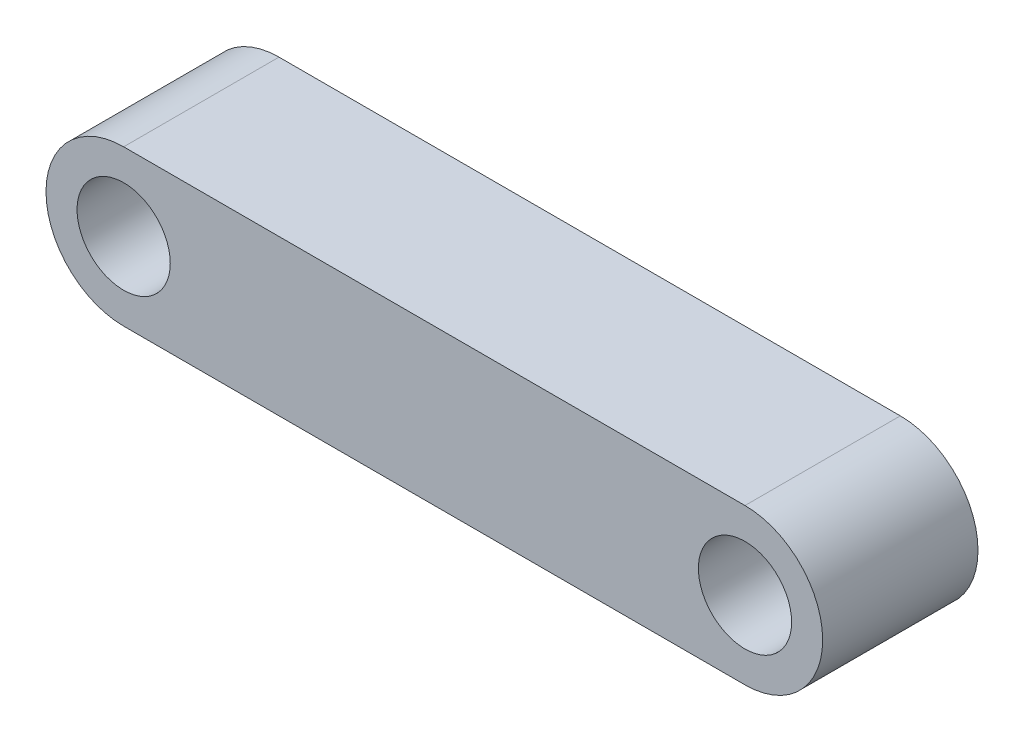
ISO-10303-21;
HEADER;
FILE_DESCRIPTION(('STEP AP214'),'2;1');
FILE_NAME('part.step','',(''),(''),'','','');
FILE_SCHEMA(('AUTOMOTIVE_DESIGN { 1 0 10303 214 1 1 1 1 }'));
ENDSEC;
DATA;
#1=APPLICATION_CONTEXT('core data for automotive mechanical design processes');
#2=APPLICATION_PROTOCOL_DEFINITION('international standard','automotive_design',2000,#1);
#3=PRODUCT_CONTEXT('',#1,'mechanical');
#4=PRODUCT('Part','Part','',(#3));
#5=PRODUCT_RELATED_PRODUCT_CATEGORY('part','',(#4));
#6=PRODUCT_DEFINITION_FORMATION('','',#4);
#7=PRODUCT_DEFINITION_CONTEXT('part definition',#1,'design');
#8=PRODUCT_DEFINITION('design','',#6,#7);
#9=PRODUCT_DEFINITION_SHAPE('','',#8);
#10=(LENGTH_UNIT() NAMED_UNIT(*) SI_UNIT(.MILLI.,.METRE.));
#11=(NAMED_UNIT(*) PLANE_ANGLE_UNIT() SI_UNIT($,.RADIAN.));
#12=(NAMED_UNIT(*) SI_UNIT($,.STERADIAN.) SOLID_ANGLE_UNIT());
#13=UNCERTAINTY_MEASURE_WITH_UNIT(LENGTH_MEASURE(1.E-05),#10,'distance_accuracy_value','');
#14=(GEOMETRIC_REPRESENTATION_CONTEXT(3) GLOBAL_UNCERTAINTY_ASSIGNED_CONTEXT((#13)) GLOBAL_UNIT_ASSIGNED_CONTEXT((#10,
#11,#12)) REPRESENTATION_CONTEXT('',''));
#15=CARTESIAN_POINT('',(0.,0.,0.));
#16=DIRECTION('',(0.,0.,1.));
#17=DIRECTION('',(1.,0.,0.));
#18=AXIS2_PLACEMENT_3D('',#15,#16,#17);
#19=CARTESIAN_POINT('',(-40.,0.,20.));
#20=DIRECTION('',(0.,0.,-1.));
#21=DIRECTION('',(-1.,0.,0.));
#22=AXIS2_PLACEMENT_3D('',#19,#20,#21);
#23=CYLINDRICAL_SURFACE('',#22,10.);
#24=CARTESIAN_POINT('',(-40.,0.,0.));
#25=DIRECTION('',(0.,0.,1.));
#26=DIRECTION('',(1.,0.,0.));
#27=AXIS2_PLACEMENT_3D('',#24,#25,#26);
#28=CIRCLE('',#27,10.);
#29=CARTESIAN_POINT('',(-40.,9.99999999999999,0.));
#30=VERTEX_POINT('',#29);
#31=CARTESIAN_POINT('',(-40.,-10.,0.));
#32=VERTEX_POINT('',#31);
#33=EDGE_CURVE('E99',#30,#32,#28,.T.);
#34=ORIENTED_EDGE('',*,*,#33,.T.);
#35=DIRECTION('',(0.,0.,-1.));
#36=VECTOR('',#35,1.);
#37=CARTESIAN_POINT('',(-40.,-10.,20.));
#38=LINE('',#37,#36);
#39=CARTESIAN_POINT('',(-40.,-10.,20.));
#40=VERTEX_POINT('',#39);
#41=EDGE_CURVE('E11',#40,#32,#38,.T.);
#42=ORIENTED_EDGE('',*,*,#41,.F.);
#43=CARTESIAN_POINT('',(-40.,0.,20.));
#44=DIRECTION('',(0.,0.,1.));
#45=DIRECTION('',(1.,0.,0.));
#46=AXIS2_PLACEMENT_3D('',#43,#44,#45);
#47=CIRCLE('',#46,10.);
#48=CARTESIAN_POINT('',(-40.,9.99999999999999,20.));
#49=VERTEX_POINT('',#48);
#50=EDGE_CURVE('E87',#49,#40,#47,.T.);
#51=ORIENTED_EDGE('',*,*,#50,.F.);
#52=DIRECTION('',(0.,0.,-1.));
#53=VECTOR('',#52,1.);
#54=CARTESIAN_POINT('',(-40.,9.99999999999999,20.));
#55=LINE('',#54,#53);
#56=EDGE_CURVE('E95',#49,#30,#55,.T.);
#57=ORIENTED_EDGE('',*,*,#56,.T.);
#58=EDGE_LOOP('',(#34,#42,#51,#57));
#59=FACE_BOUND('',#58,.T.);
#60=ADVANCED_FACE('F36',(#59),#23,.T.);
#61=CARTESIAN_POINT('',(40.,-9.99999999999999,20.));
#62=DIRECTION('',(0.,1.,0.));
#63=DIRECTION('',(-1.,0.,0.));
#64=AXIS2_PLACEMENT_3D('',#61,#62,#63);
#65=PLANE('',#64);
#66=DIRECTION('',(1.,0.,0.));
#67=VECTOR('',#66,1.);
#68=CARTESIAN_POINT('',(40.,-9.99999999999999,0.));
#69=LINE('',#68,#67);
#70=CARTESIAN_POINT('',(40.,-9.99999999999999,0.));
#71=VERTEX_POINT('',#70);
#72=EDGE_CURVE('E91',#32,#71,#69,.T.);
#73=ORIENTED_EDGE('',*,*,#72,.T.);
#74=DIRECTION('',(0.,0.,-1.));
#75=VECTOR('',#74,1.);
#76=CARTESIAN_POINT('',(40.,-9.99999999999999,20.));
#77=LINE('',#76,#75);
#78=CARTESIAN_POINT('',(40.,-9.99999999999999,20.));
#79=VERTEX_POINT('',#78);
#80=EDGE_CURVE('E44',#79,#71,#77,.T.);
#81=ORIENTED_EDGE('',*,*,#80,.F.);
#82=DIRECTION('',(1.,0.,0.));
#83=VECTOR('',#82,1.);
#84=CARTESIAN_POINT('',(40.,-9.99999999999999,20.));
#85=LINE('',#84,#83);
#86=EDGE_CURVE('E82',#40,#79,#85,.T.);
#87=ORIENTED_EDGE('',*,*,#86,.F.);
#88=ORIENTED_EDGE('',*,*,#41,.T.);
#89=EDGE_LOOP('',(#73,#81,#87,#88));
#90=FACE_BOUND('',#89,.T.);
#91=ADVANCED_FACE('F90',(#90),#65,.F.);
#92=CARTESIAN_POINT('',(40.,0.,20.));
#93=DIRECTION('',(0.,0.,-1.));
#94=DIRECTION('',(-1.,0.,0.));
#95=AXIS2_PLACEMENT_3D('',#92,#93,#94);
#96=CYLINDRICAL_SURFACE('',#95,10.);
#97=CARTESIAN_POINT('',(40.,0.,0.));
#98=DIRECTION('',(0.,0.,1.));
#99=DIRECTION('',(-1.,0.,0.));
#100=AXIS2_PLACEMENT_3D('',#97,#98,#99);
#101=CIRCLE('',#100,10.);
#102=CARTESIAN_POINT('',(40.,10.,0.));
#103=VERTEX_POINT('',#102);
#104=EDGE_CURVE('E69',#71,#103,#101,.T.);
#105=ORIENTED_EDGE('',*,*,#104,.T.);
#106=DIRECTION('',(0.,0.,-1.));
#107=VECTOR('',#106,1.);
#108=CARTESIAN_POINT('',(40.,10.,20.));
#109=LINE('',#108,#107);
#110=CARTESIAN_POINT('',(40.,10.,20.));
#111=VERTEX_POINT('',#110);
#112=EDGE_CURVE('E92',#111,#103,#109,.T.);
#113=ORIENTED_EDGE('',*,*,#112,.F.);
#114=CARTESIAN_POINT('',(40.,0.,20.));
#115=DIRECTION('',(0.,0.,1.));
#116=DIRECTION('',(-1.,0.,0.));
#117=AXIS2_PLACEMENT_3D('',#114,#115,#116);
#118=CIRCLE('',#117,10.);
#119=EDGE_CURVE('E85',#79,#111,#118,.T.);
#120=ORIENTED_EDGE('',*,*,#119,.F.);
#121=ORIENTED_EDGE('',*,*,#80,.T.);
#122=EDGE_LOOP('',(#105,#113,#120,#121));
#123=FACE_BOUND('',#122,.T.);
#124=ADVANCED_FACE('F93',(#123),#96,.T.);
#125=CARTESIAN_POINT('',(40.,10.,20.));
#126=DIRECTION('',(0.,-1.,0.));
#127=DIRECTION('',(1.,0.,0.));
#128=AXIS2_PLACEMENT_3D('',#125,#126,#127);
#129=PLANE('',#128);
#130=DIRECTION('',(-1.,0.,0.));
#131=VECTOR('',#130,1.);
#132=CARTESIAN_POINT('',(40.,10.,0.));
#133=LINE('',#132,#131);
#134=EDGE_CURVE('E75',#103,#30,#133,.T.);
#135=ORIENTED_EDGE('',*,*,#134,.T.);
#136=ORIENTED_EDGE('',*,*,#56,.F.);
#137=DIRECTION('',(-1.,0.,0.));
#138=VECTOR('',#137,1.);
#139=CARTESIAN_POINT('',(40.,10.,20.));
#140=LINE('',#139,#138);
#141=EDGE_CURVE('E52',#111,#49,#140,.T.);
#142=ORIENTED_EDGE('',*,*,#141,.F.);
#143=ORIENTED_EDGE('',*,*,#112,.T.);
#144=EDGE_LOOP('',(#135,#136,#142,#143));
#145=FACE_BOUND('',#144,.T.);
#146=ADVANCED_FACE('F107',(#145),#129,.F.);
#147=CARTESIAN_POINT('',(-40.,0.,20.));
#148=DIRECTION('',(0.,0.,1.));
#149=DIRECTION('',(1.,0.,0.));
#150=AXIS2_PLACEMENT_3D('',#147,#148,#149);
#151=PLANE('',#150);
#152=CARTESIAN_POINT('',(-40.,0.,20.));
#153=DIRECTION('',(0.,0.,1.));
#154=DIRECTION('',(1.,0.,0.));
#155=AXIS2_PLACEMENT_3D('',#152,#153,#154);
#156=CIRCLE('',#155,6.);
#157=CARTESIAN_POINT('',(-34.,0.,20.));
#158=VERTEX_POINT('',#157);
#159=EDGE_CURVE('E119',#158,#158,#156,.T.);
#160=ORIENTED_EDGE('',*,*,#159,.F.);
#161=EDGE_LOOP('',(#160));
#162=FACE_BOUND('',#161,.T.);
#163=CARTESIAN_POINT('',(40.,0.,20.));
#164=DIRECTION('',(0.,0.,1.));
#165=DIRECTION('',(1.,0.,0.));
#166=AXIS2_PLACEMENT_3D('',#163,#164,#165);
#167=CIRCLE('',#166,6.);
#168=CARTESIAN_POINT('',(46.,0.,20.));
#169=VERTEX_POINT('',#168);
#170=EDGE_CURVE('E113',#169,#169,#167,.T.);
#171=ORIENTED_EDGE('',*,*,#170,.F.);
#172=EDGE_LOOP('',(#171));
#173=FACE_BOUND('',#172,.T.);
#174=ORIENTED_EDGE('',*,*,#50,.T.);
#175=ORIENTED_EDGE('',*,*,#86,.T.);
#176=ORIENTED_EDGE('',*,*,#119,.T.);
#177=ORIENTED_EDGE('',*,*,#141,.T.);
#178=EDGE_LOOP('',(#174,#175,#176,#177));
#179=FACE_BOUND('',#178,.T.);
#180=ADVANCED_FACE('F83',(#162,#173,#179),#151,.T.);
#181=CARTESIAN_POINT('',(-40.,0.,0.));
#182=DIRECTION('',(0.,0.,1.));
#183=DIRECTION('',(1.,0.,0.));
#184=AXIS2_PLACEMENT_3D('',#181,#182,#183);
#185=PLANE('',#184);
#186=CARTESIAN_POINT('',(-40.,0.,0.));
#187=DIRECTION('',(0.,0.,1.));
#188=DIRECTION('',(1.,0.,0.));
#189=AXIS2_PLACEMENT_3D('',#186,#187,#188);
#190=CIRCLE('',#189,6.);
#191=CARTESIAN_POINT('',(-34.,0.,0.));
#192=VERTEX_POINT('',#191);
#193=EDGE_CURVE('E102',#192,#192,#190,.T.);
#194=ORIENTED_EDGE('',*,*,#193,.T.);
#195=EDGE_LOOP('',(#194));
#196=FACE_BOUND('',#195,.T.);
#197=CARTESIAN_POINT('',(40.,0.,0.));
#198=DIRECTION('',(0.,0.,1.));
#199=DIRECTION('',(1.,0.,0.));
#200=AXIS2_PLACEMENT_3D('',#197,#198,#199);
#201=CIRCLE('',#200,6.);
#202=CARTESIAN_POINT('',(46.,0.,0.));
#203=VERTEX_POINT('',#202);
#204=EDGE_CURVE('E116',#203,#203,#201,.T.);
#205=ORIENTED_EDGE('',*,*,#204,.T.);
#206=EDGE_LOOP('',(#205));
#207=FACE_BOUND('',#206,.T.);
#208=ORIENTED_EDGE('',*,*,#33,.F.);
#209=ORIENTED_EDGE('',*,*,#134,.F.);
#210=ORIENTED_EDGE('',*,*,#104,.F.);
#211=ORIENTED_EDGE('',*,*,#72,.F.);
#212=EDGE_LOOP('',(#208,#209,#210,#211));
#213=FACE_BOUND('',#212,.T.);
#214=ADVANCED_FACE('F110',(#196,#207,#213),#185,.F.);
#215=CARTESIAN_POINT('',(40.,0.,0.));
#216=DIRECTION('',(0.,0.,1.));
#217=DIRECTION('',(1.,0.,0.));
#218=AXIS2_PLACEMENT_3D('',#215,#216,#217);
#219=CYLINDRICAL_SURFACE('',#218,6.);
#220=ORIENTED_EDGE('',*,*,#204,.F.);
#221=EDGE_LOOP('',(#220));
#222=FACE_BOUND('',#221,.T.);
#223=ORIENTED_EDGE('',*,*,#170,.T.);
#224=EDGE_LOOP('',(#223));
#225=FACE_BOUND('',#224,.T.);
#226=ADVANCED_FACE('F130',(#222,#225),#219,.F.);
#227=CARTESIAN_POINT('',(-40.,0.,0.));
#228=DIRECTION('',(0.,0.,1.));
#229=DIRECTION('',(1.,0.,0.));
#230=AXIS2_PLACEMENT_3D('',#227,#228,#229);
#231=CYLINDRICAL_SURFACE('',#230,6.);
#232=ORIENTED_EDGE('',*,*,#193,.F.);
#233=EDGE_LOOP('',(#232));
#234=FACE_BOUND('',#233,.T.);
#235=ORIENTED_EDGE('',*,*,#159,.T.);
#236=EDGE_LOOP('',(#235));
#237=FACE_BOUND('',#236,.T.);
#238=ADVANCED_FACE('F127',(#234,#237),#231,.F.);
#239=CLOSED_SHELL('',(#60,#91,#124,#146,#180,#214,#226,#238));
#240=MANIFOLD_SOLID_BREP('B2',#239);
#241=ADVANCED_BREP_SHAPE_REPRESENTATION('',(#18,#240),#14);
#242=SHAPE_DEFINITION_REPRESENTATION(#9,#241);
ENDSEC;
END-ISO-10303-21;
